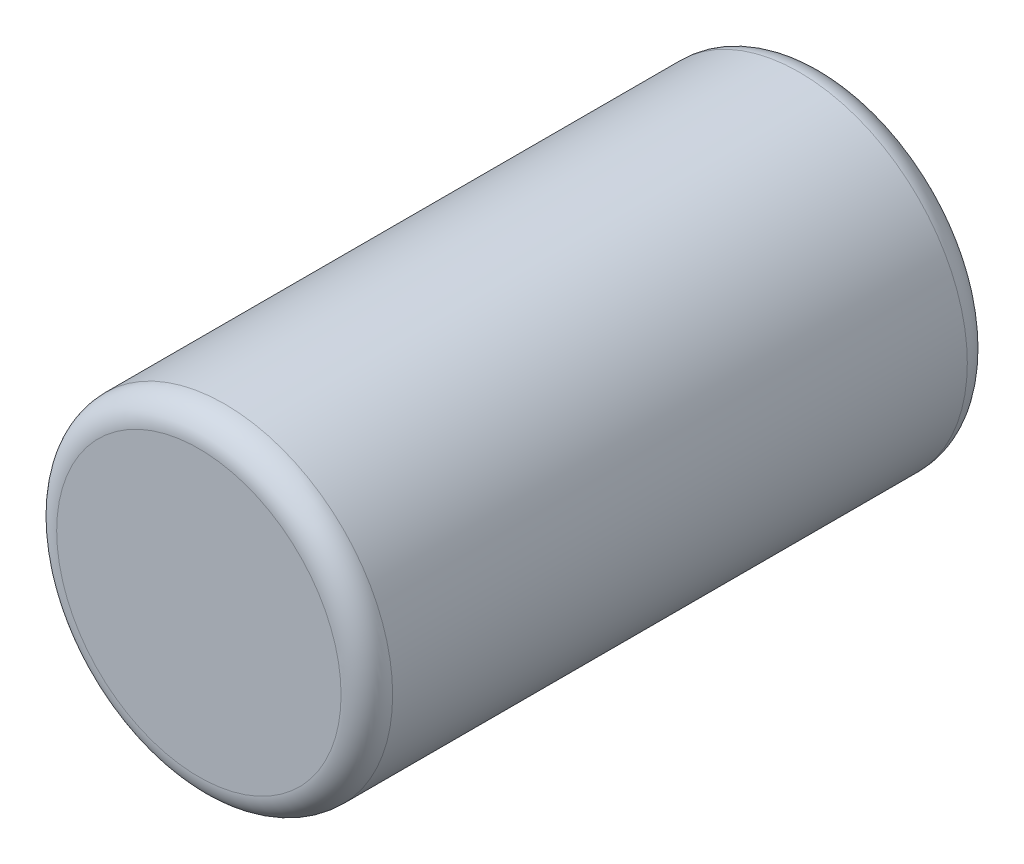
ISO-10303-21;
HEADER;
FILE_DESCRIPTION(('STEP AP214'),'2;1');
FILE_NAME('part.step','',(''),(''),'','','');
FILE_SCHEMA(('AUTOMOTIVE_DESIGN { 1 0 10303 214 1 1 1 1 }'));
ENDSEC;
DATA;
#1=APPLICATION_CONTEXT('core data for automotive mechanical design processes');
#2=APPLICATION_PROTOCOL_DEFINITION('international standard','automotive_design',2000,#1);
#3=PRODUCT_CONTEXT('',#1,'mechanical');
#4=PRODUCT('Part','Part','',(#3));
#5=PRODUCT_RELATED_PRODUCT_CATEGORY('part','',(#4));
#6=PRODUCT_DEFINITION_FORMATION('','',#4);
#7=PRODUCT_DEFINITION_CONTEXT('part definition',#1,'design');
#8=PRODUCT_DEFINITION('design','',#6,#7);
#9=PRODUCT_DEFINITION_SHAPE('','',#8);
#10=(LENGTH_UNIT() NAMED_UNIT(*) SI_UNIT(.MILLI.,.METRE.));
#11=(NAMED_UNIT(*) PLANE_ANGLE_UNIT() SI_UNIT($,.RADIAN.));
#12=(NAMED_UNIT(*) SI_UNIT($,.STERADIAN.) SOLID_ANGLE_UNIT());
#13=UNCERTAINTY_MEASURE_WITH_UNIT(LENGTH_MEASURE(1.E-05),#10,'distance_accuracy_value','');
#14=(GEOMETRIC_REPRESENTATION_CONTEXT(3) GLOBAL_UNCERTAINTY_ASSIGNED_CONTEXT((#13)) GLOBAL_UNIT_ASSIGNED_CONTEXT((#10,
#11,#12)) REPRESENTATION_CONTEXT('',''));
#15=CARTESIAN_POINT('',(0.,0.,0.));
#16=DIRECTION('',(0.,0.,1.));
#17=DIRECTION('',(1.,0.,0.));
#18=AXIS2_PLACEMENT_3D('',#15,#16,#17);
#19=CARTESIAN_POINT('',(0.,9.65,0.));
#20=DIRECTION('',(0.,0.,-1.));
#21=DIRECTION('',(-1.,0.,0.));
#22=AXIS2_PLACEMENT_3D('',#19,#20,#21);
#23=PLANE('',#22);
#24=CARTESIAN_POINT('',(0.,0.,0.));
#25=DIRECTION('',(0.,0.,1.));
#26=DIRECTION('',(1.,0.,0.));
#27=AXIS2_PLACEMENT_3D('',#24,#25,#26);
#28=CIRCLE('',#27,9.65);
#29=CARTESIAN_POINT('',(9.65,0.,0.));
#30=VERTEX_POINT('',#29);
#31=EDGE_CURVE('E53',#30,#30,#28,.T.);
#32=ORIENTED_EDGE('',*,*,#31,.T.);
#33=EDGE_LOOP('',(#32));
#34=FACE_BOUND('',#33,.T.);
#35=ADVANCED_FACE('F39',(#34),#23,.F.);
#36=CARTESIAN_POINT('',(0.,0.,-42.5));
#37=DIRECTION('',(0.,0.,1.));
#38=DIRECTION('',(1.,0.,0.));
#39=AXIS2_PLACEMENT_3D('',#36,#37,#38);
#40=PLANE('',#39);
#41=CARTESIAN_POINT('',(0.,0.,-42.5));
#42=DIRECTION('',(0.,0.,1.));
#43=DIRECTION('',(1.,0.,0.));
#44=AXIS2_PLACEMENT_3D('',#41,#42,#43);
#45=CIRCLE('',#44,9.65);
#46=CARTESIAN_POINT('',(9.65,0.,-42.5));
#47=VERTEX_POINT('',#46);
#48=EDGE_CURVE('E10',#47,#47,#45,.T.);
#49=ORIENTED_EDGE('',*,*,#48,.F.);
#50=EDGE_LOOP('',(#49));
#51=FACE_BOUND('',#50,.T.);
#52=ADVANCED_FACE('F73',(#51),#40,.F.);
#53=CARTESIAN_POINT('',(0.,0.,-40.75));
#54=DIRECTION('',(0.,0.,1.));
#55=DIRECTION('',(1.,0.,0.));
#56=AXIS2_PLACEMENT_3D('',#53,#54,#55);
#57=TOROIDAL_SURFACE('',#56,9.65,1.75);
#58=CARTESIAN_POINT('',(0.,0.,-40.75));
#59=DIRECTION('',(0.,0.,1.));
#60=DIRECTION('',(1.,0.,0.));
#61=AXIS2_PLACEMENT_3D('',#58,#59,#60);
#62=CIRCLE('',#61,11.4);
#63=CARTESIAN_POINT('',(11.4,0.,-40.75));
#64=VERTEX_POINT('',#63);
#65=EDGE_CURVE('E45',#64,#64,#62,.T.);
#66=ORIENTED_EDGE('',*,*,#65,.F.);
#67=EDGE_LOOP('',(#66));
#68=FACE_BOUND('',#67,.T.);
#69=ORIENTED_EDGE('',*,*,#48,.T.);
#70=EDGE_LOOP('',(#69));
#71=FACE_BOUND('',#70,.T.);
#72=ADVANCED_FACE('F68',(#68,#71),#57,.T.);
#73=CARTESIAN_POINT('',(0.,0.,0.));
#74=DIRECTION('',(0.,0.,1.));
#75=DIRECTION('',(1.,0.,0.));
#76=AXIS2_PLACEMENT_3D('',#73,#74,#75);
#77=CYLINDRICAL_SURFACE('',#76,11.4);
#78=CARTESIAN_POINT('',(0.,0.,-1.75));
#79=DIRECTION('',(0.,0.,1.));
#80=DIRECTION('',(1.,0.,0.));
#81=AXIS2_PLACEMENT_3D('',#78,#79,#80);
#82=CIRCLE('',#81,11.4);
#83=CARTESIAN_POINT('',(11.4,0.,-1.75));
#84=VERTEX_POINT('',#83);
#85=EDGE_CURVE('E49',#84,#84,#82,.T.);
#86=ORIENTED_EDGE('',*,*,#85,.F.);
#87=EDGE_LOOP('',(#86));
#88=FACE_BOUND('',#87,.T.);
#89=ORIENTED_EDGE('',*,*,#65,.T.);
#90=EDGE_LOOP('',(#89));
#91=FACE_BOUND('',#90,.T.);
#92=ADVANCED_FACE('F63',(#88,#91),#77,.T.);
#93=CARTESIAN_POINT('',(0.,0.,-1.75));
#94=DIRECTION('',(0.,0.,1.));
#95=DIRECTION('',(1.,0.,0.));
#96=AXIS2_PLACEMENT_3D('',#93,#94,#95);
#97=TOROIDAL_SURFACE('',#96,9.65,1.75);
#98=ORIENTED_EDGE('',*,*,#31,.F.);
#99=EDGE_LOOP('',(#98));
#100=FACE_BOUND('',#99,.T.);
#101=ORIENTED_EDGE('',*,*,#85,.T.);
#102=EDGE_LOOP('',(#101));
#103=FACE_BOUND('',#102,.T.);
#104=ADVANCED_FACE('F60',(#100,#103),#97,.T.);
#105=CLOSED_SHELL('',(#35,#52,#72,#92,#104));
#106=MANIFOLD_SOLID_BREP('B2',#105);
#107=ADVANCED_BREP_SHAPE_REPRESENTATION('',(#18,#106),#14);
#108=SHAPE_DEFINITION_REPRESENTATION(#9,#107);
ENDSEC;
END-ISO-10303-21;
